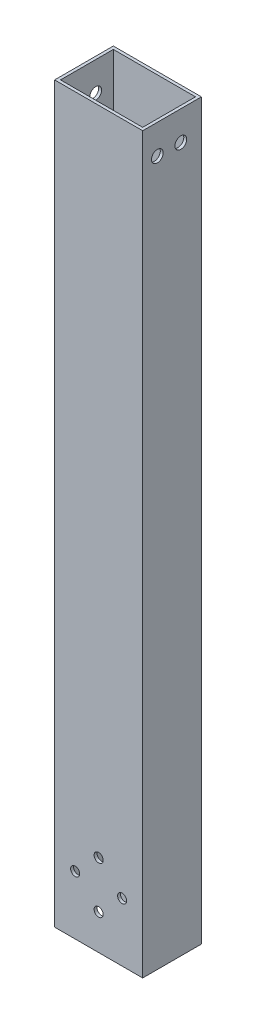
ISO-10303-21;
HEADER;
FILE_DESCRIPTION(('STEP AP214'),'2;1');
FILE_NAME('part.step','',(''),(''),'','','');
FILE_SCHEMA(('AUTOMOTIVE_DESIGN { 1 0 10303 214 1 1 1 1 }'));
ENDSEC;
DATA;
#1=APPLICATION_CONTEXT('core data for automotive mechanical design processes');
#2=APPLICATION_PROTOCOL_DEFINITION('international standard','automotive_design',2000,#1);
#3=PRODUCT_CONTEXT('',#1,'mechanical');
#4=PRODUCT('Part','Part','',(#3));
#5=PRODUCT_RELATED_PRODUCT_CATEGORY('part','',(#4));
#6=PRODUCT_DEFINITION_FORMATION('','',#4);
#7=PRODUCT_DEFINITION_CONTEXT('part definition',#1,'design');
#8=PRODUCT_DEFINITION('design','',#6,#7);
#9=PRODUCT_DEFINITION_SHAPE('','',#8);
#10=(LENGTH_UNIT() NAMED_UNIT(*) SI_UNIT(.MILLI.,.METRE.));
#11=(NAMED_UNIT(*) PLANE_ANGLE_UNIT() SI_UNIT($,.RADIAN.));
#12=(NAMED_UNIT(*) SI_UNIT($,.STERADIAN.) SOLID_ANGLE_UNIT());
#13=UNCERTAINTY_MEASURE_WITH_UNIT(LENGTH_MEASURE(1.E-05),#10,'distance_accuracy_value','');
#14=(GEOMETRIC_REPRESENTATION_CONTEXT(3) GLOBAL_UNCERTAINTY_ASSIGNED_CONTEXT((#13)) GLOBAL_UNIT_ASSIGNED_CONTEXT((#10,
#11,#12)) REPRESENTATION_CONTEXT('',''));
#15=CARTESIAN_POINT('',(0.,0.,0.));
#16=DIRECTION('',(0.,0.,1.));
#17=DIRECTION('',(1.,0.,0.));
#18=AXIS2_PLACEMENT_3D('',#15,#16,#17);
#19=CARTESIAN_POINT('',(0.,250.,0.));
#20=DIRECTION('',(0.,-1.,0.));
#21=DIRECTION('',(0.,0.,-1.));
#22=AXIS2_PLACEMENT_3D('',#19,#20,#21);
#23=PLANE('',#22);
#24=DIRECTION('',(0.,0.,-1.));
#25=VECTOR('',#24,1.);
#26=CARTESIAN_POINT('',(15.,250.,10.));
#27=LINE('',#26,#25);
#28=CARTESIAN_POINT('',(15.,250.,10.));
#29=VERTEX_POINT('',#28);
#30=CARTESIAN_POINT('',(15.,250.,-10.));
#31=VERTEX_POINT('',#30);
#32=EDGE_CURVE('E140',#29,#31,#27,.T.);
#33=ORIENTED_EDGE('',*,*,#32,.T.);
#34=DIRECTION('',(-1.,0.,0.));
#35=VECTOR('',#34,1.);
#36=CARTESIAN_POINT('',(-15.,250.,-10.));
#37=LINE('',#36,#35);
#38=CARTESIAN_POINT('',(-15.,250.,-10.));
#39=VERTEX_POINT('',#38);
#40=EDGE_CURVE('E143',#31,#39,#37,.T.);
#41=ORIENTED_EDGE('',*,*,#40,.T.);
#42=DIRECTION('',(0.,0.,1.));
#43=VECTOR('',#42,1.);
#44=CARTESIAN_POINT('',(-15.,250.,10.));
#45=LINE('',#44,#43);
#46=CARTESIAN_POINT('',(-15.,250.,10.));
#47=VERTEX_POINT('',#46);
#48=EDGE_CURVE('E146',#39,#47,#45,.T.);
#49=ORIENTED_EDGE('',*,*,#48,.T.);
#50=DIRECTION('',(1.,0.,0.));
#51=VECTOR('',#50,1.);
#52=CARTESIAN_POINT('',(-15.,250.,10.));
#53=LINE('',#52,#51);
#54=EDGE_CURVE('E148',#47,#29,#53,.T.);
#55=ORIENTED_EDGE('',*,*,#54,.T.);
#56=EDGE_LOOP('',(#33,#41,#49,#55));
#57=FACE_BOUND('',#56,.T.);
#58=DIRECTION('',(0.,0.,-1.));
#59=VECTOR('',#58,1.);
#60=CARTESIAN_POINT('',(14.,250.,9.00000000000001));
#61=LINE('',#60,#59);
#62=CARTESIAN_POINT('',(14.,250.,9.00000000000001));
#63=VERTEX_POINT('',#62);
#64=CARTESIAN_POINT('',(14.,250.,-9.00000000000001));
#65=VERTEX_POINT('',#64);
#66=EDGE_CURVE('E102',#63,#65,#61,.T.);
#67=ORIENTED_EDGE('',*,*,#66,.F.);
#68=DIRECTION('',(1.,0.,0.));
#69=VECTOR('',#68,1.);
#70=CARTESIAN_POINT('',(-14.,250.,9.00000000000001));
#71=LINE('',#70,#69);
#72=CARTESIAN_POINT('',(-14.,250.,9.00000000000001));
#73=VERTEX_POINT('',#72);
#74=EDGE_CURVE('E124',#73,#63,#71,.T.);
#75=ORIENTED_EDGE('',*,*,#74,.F.);
#76=DIRECTION('',(0.,0.,1.));
#77=VECTOR('',#76,1.);
#78=CARTESIAN_POINT('',(-14.,250.,9.00000000000001));
#79=LINE('',#78,#77);
#80=CARTESIAN_POINT('',(-14.,250.,-9.));
#81=VERTEX_POINT('',#80);
#82=EDGE_CURVE('E122',#81,#73,#79,.T.);
#83=ORIENTED_EDGE('',*,*,#82,.F.);
#84=DIRECTION('',(-1.,0.,0.));
#85=VECTOR('',#84,1.);
#86=CARTESIAN_POINT('',(-14.,250.,-9.));
#87=LINE('',#86,#85);
#88=EDGE_CURVE('E110',#65,#81,#87,.T.);
#89=ORIENTED_EDGE('',*,*,#88,.F.);
#90=EDGE_LOOP('',(#67,#75,#83,#89));
#91=FACE_BOUND('',#90,.T.);
#92=ADVANCED_FACE('F35',(#57,#91),#23,.F.);
#93=CARTESIAN_POINT('',(0.,0.,0.));
#94=DIRECTION('',(0.,-1.,0.));
#95=DIRECTION('',(0.,0.,-1.));
#96=AXIS2_PLACEMENT_3D('',#93,#94,#95);
#97=PLANE('',#96);
#98=DIRECTION('',(0.,0.,-1.));
#99=VECTOR('',#98,1.);
#100=CARTESIAN_POINT('',(15.,0.,10.));
#101=LINE('',#100,#99);
#102=CARTESIAN_POINT('',(15.,0.,10.));
#103=VERTEX_POINT('',#102);
#104=CARTESIAN_POINT('',(15.,0.,-10.));
#105=VERTEX_POINT('',#104);
#106=EDGE_CURVE('E118',#103,#105,#101,.T.);
#107=ORIENTED_EDGE('',*,*,#106,.F.);
#108=DIRECTION('',(1.,0.,0.));
#109=VECTOR('',#108,1.);
#110=CARTESIAN_POINT('',(-15.,0.,10.));
#111=LINE('',#110,#109);
#112=CARTESIAN_POINT('',(-15.,0.,10.));
#113=VERTEX_POINT('',#112);
#114=EDGE_CURVE('E144',#113,#103,#111,.T.);
#115=ORIENTED_EDGE('',*,*,#114,.F.);
#116=DIRECTION('',(0.,0.,1.));
#117=VECTOR('',#116,1.);
#118=CARTESIAN_POINT('',(-15.,0.,10.));
#119=LINE('',#118,#117);
#120=CARTESIAN_POINT('',(-15.,0.,-10.));
#121=VERTEX_POINT('',#120);
#122=EDGE_CURVE('E155',#121,#113,#119,.T.);
#123=ORIENTED_EDGE('',*,*,#122,.F.);
#124=DIRECTION('',(-1.,0.,0.));
#125=VECTOR('',#124,1.);
#126=CARTESIAN_POINT('',(-15.,0.,-10.));
#127=LINE('',#126,#125);
#128=EDGE_CURVE('E153',#105,#121,#127,.T.);
#129=ORIENTED_EDGE('',*,*,#128,.F.);
#130=EDGE_LOOP('',(#107,#115,#123,#129));
#131=FACE_BOUND('',#130,.T.);
#132=DIRECTION('',(1.,0.,0.));
#133=VECTOR('',#132,1.);
#134=CARTESIAN_POINT('',(-14.,0.,9.00000000000001));
#135=LINE('',#134,#133);
#136=CARTESIAN_POINT('',(-14.,0.,9.00000000000001));
#137=VERTEX_POINT('',#136);
#138=CARTESIAN_POINT('',(14.,0.,9.00000000000001));
#139=VERTEX_POINT('',#138);
#140=EDGE_CURVE('E111',#137,#139,#135,.T.);
#141=ORIENTED_EDGE('',*,*,#140,.T.);
#142=DIRECTION('',(0.,0.,-1.));
#143=VECTOR('',#142,1.);
#144=CARTESIAN_POINT('',(14.,0.,9.00000000000001));
#145=LINE('',#144,#143);
#146=CARTESIAN_POINT('',(14.,0.,-9.00000000000001));
#147=VERTEX_POINT('',#146);
#148=EDGE_CURVE('E60',#139,#147,#145,.T.);
#149=ORIENTED_EDGE('',*,*,#148,.T.);
#150=DIRECTION('',(-1.,0.,0.));
#151=VECTOR('',#150,1.);
#152=CARTESIAN_POINT('',(-14.,0.,-9.));
#153=LINE('',#152,#151);
#154=CARTESIAN_POINT('',(-14.,0.,-9.));
#155=VERTEX_POINT('',#154);
#156=EDGE_CURVE('E117',#147,#155,#153,.T.);
#157=ORIENTED_EDGE('',*,*,#156,.T.);
#158=DIRECTION('',(0.,0.,1.));
#159=VECTOR('',#158,1.);
#160=CARTESIAN_POINT('',(-14.,0.,9.00000000000001));
#161=LINE('',#160,#159);
#162=EDGE_CURVE('E132',#155,#137,#161,.T.);
#163=ORIENTED_EDGE('',*,*,#162,.T.);
#164=EDGE_LOOP('',(#141,#149,#157,#163));
#165=FACE_BOUND('',#164,.T.);
#166=ADVANCED_FACE('F272',(#131,#165),#97,.T.);
#167=CARTESIAN_POINT('',(15.,250.,10.));
#168=DIRECTION('',(-1.,0.,0.));
#169=DIRECTION('',(0.,0.,1.));
#170=AXIS2_PLACEMENT_3D('',#167,#168,#169);
#171=PLANE('',#170);
#172=CARTESIAN_POINT('',(15.,240.,5.));
#173=DIRECTION('',(1.,0.,0.));
#174=DIRECTION('',(0.,0.,-1.));
#175=AXIS2_PLACEMENT_3D('',#172,#173,#174);
#176=CIRCLE('',#175,2.);
#177=CARTESIAN_POINT('',(15.,240.,3.));
#178=VERTEX_POINT('',#177);
#179=EDGE_CURVE('E189',#178,#178,#176,.T.);
#180=ORIENTED_EDGE('',*,*,#179,.F.);
#181=EDGE_LOOP('',(#180));
#182=FACE_BOUND('',#181,.T.);
#183=CARTESIAN_POINT('',(15.,240.,-3.));
#184=DIRECTION('',(1.,0.,0.));
#185=DIRECTION('',(0.,0.,-1.));
#186=AXIS2_PLACEMENT_3D('',#183,#184,#185);
#187=CIRCLE('',#186,2.);
#188=CARTESIAN_POINT('',(15.,240.,-5.));
#189=VERTEX_POINT('',#188);
#190=EDGE_CURVE('E197',#189,#189,#187,.T.);
#191=ORIENTED_EDGE('',*,*,#190,.F.);
#192=EDGE_LOOP('',(#191));
#193=FACE_BOUND('',#192,.T.);
#194=ORIENTED_EDGE('',*,*,#106,.T.);
#195=DIRECTION('',(0.,-1.,0.));
#196=VECTOR('',#195,1.);
#197=CARTESIAN_POINT('',(15.,250.,-10.));
#198=LINE('',#197,#196);
#199=EDGE_CURVE('E11',#31,#105,#198,.T.);
#200=ORIENTED_EDGE('',*,*,#199,.F.);
#201=ORIENTED_EDGE('',*,*,#32,.F.);
#202=DIRECTION('',(0.,-1.,0.));
#203=VECTOR('',#202,1.);
#204=CARTESIAN_POINT('',(15.,250.,10.));
#205=LINE('',#204,#203);
#206=EDGE_CURVE('E150',#29,#103,#205,.T.);
#207=ORIENTED_EDGE('',*,*,#206,.T.);
#208=EDGE_LOOP('',(#194,#200,#201,#207));
#209=FACE_BOUND('',#208,.T.);
#210=ADVANCED_FACE('F37',(#182,#193,#209),#171,.F.);
#211=CARTESIAN_POINT('',(-15.,250.,-10.));
#212=DIRECTION('',(0.,0.,1.));
#213=DIRECTION('',(1.,0.,0.));
#214=AXIS2_PLACEMENT_3D('',#211,#212,#213);
#215=PLANE('',#214);
#216=CARTESIAN_POINT('',(1.26257310727977E-13,28.,-10.));
#217=DIRECTION('',(0.,0.,1.));
#218=DIRECTION('',(1.,0.,0.));
#219=AXIS2_PLACEMENT_3D('',#216,#217,#218);
#220=CIRCLE('',#219,1.54999999999989);
#221=CARTESIAN_POINT('',(1.55000000000002,28.,-10.));
#222=VERTEX_POINT('',#221);
#223=EDGE_CURVE('E169',#222,#222,#220,.T.);
#224=ORIENTED_EDGE('',*,*,#223,.T.);
#225=EDGE_LOOP('',(#224));
#226=FACE_BOUND('',#225,.T.);
#227=CARTESIAN_POINT('',(8.00000000000013,20.,-10.));
#228=DIRECTION('',(0.,0.,1.));
#229=DIRECTION('',(1.,0.,0.));
#230=AXIS2_PLACEMENT_3D('',#227,#228,#229);
#231=CIRCLE('',#230,1.55);
#232=CARTESIAN_POINT('',(9.55000000000013,20.,-10.));
#233=VERTEX_POINT('',#232);
#234=EDGE_CURVE('E209',#233,#233,#231,.T.);
#235=ORIENTED_EDGE('',*,*,#234,.T.);
#236=EDGE_LOOP('',(#235));
#237=FACE_BOUND('',#236,.T.);
#238=CARTESIAN_POINT('',(1.26257310727977E-13,12.,-10.));
#239=DIRECTION('',(0.,0.,1.));
#240=DIRECTION('',(1.,0.,0.));
#241=AXIS2_PLACEMENT_3D('',#238,#239,#240);
#242=CIRCLE('',#241,1.55000000000011);
#243=CARTESIAN_POINT('',(1.55000000000023,12.,-10.));
#244=VERTEX_POINT('',#243);
#245=EDGE_CURVE('E215',#244,#244,#242,.T.);
#246=ORIENTED_EDGE('',*,*,#245,.T.);
#247=EDGE_LOOP('',(#246));
#248=FACE_BOUND('',#247,.T.);
#249=CARTESIAN_POINT('',(-7.99999999999988,20.,-10.));
#250=DIRECTION('',(0.,0.,1.));
#251=DIRECTION('',(1.,0.,0.));
#252=AXIS2_PLACEMENT_3D('',#249,#250,#251);
#253=CIRCLE('',#252,1.55000000000001);
#254=CARTESIAN_POINT('',(-6.44999999999987,20.,-10.));
#255=VERTEX_POINT('',#254);
#256=EDGE_CURVE('E221',#255,#255,#253,.T.);
#257=ORIENTED_EDGE('',*,*,#256,.T.);
#258=EDGE_LOOP('',(#257));
#259=FACE_BOUND('',#258,.T.);
#260=ORIENTED_EDGE('',*,*,#128,.T.);
#261=DIRECTION('',(0.,-1.,0.));
#262=VECTOR('',#261,1.);
#263=CARTESIAN_POINT('',(-15.,250.,-10.));
#264=LINE('',#263,#262);
#265=EDGE_CURVE('E44',#39,#121,#264,.T.);
#266=ORIENTED_EDGE('',*,*,#265,.F.);
#267=ORIENTED_EDGE('',*,*,#40,.F.);
#268=ORIENTED_EDGE('',*,*,#199,.T.);
#269=EDGE_LOOP('',(#260,#266,#267,#268));
#270=FACE_BOUND('',#269,.T.);
#271=ADVANCED_FACE('F258',(#226,#237,#248,#259,#270),#215,.F.);
#272=CARTESIAN_POINT('',(-15.,250.,10.));
#273=DIRECTION('',(1.,0.,0.));
#274=DIRECTION('',(0.,0.,-1.));
#275=AXIS2_PLACEMENT_3D('',#272,#273,#274);
#276=PLANE('',#275);
#277=CARTESIAN_POINT('',(-15.,240.,5.));
#278=DIRECTION('',(1.,0.,0.));
#279=DIRECTION('',(0.,0.,-1.));
#280=AXIS2_PLACEMENT_3D('',#277,#278,#279);
#281=CIRCLE('',#280,2.);
#282=CARTESIAN_POINT('',(-15.,240.,3.));
#283=VERTEX_POINT('',#282);
#284=EDGE_CURVE('E183',#283,#283,#281,.T.);
#285=ORIENTED_EDGE('',*,*,#284,.T.);
#286=EDGE_LOOP('',(#285));
#287=FACE_BOUND('',#286,.T.);
#288=CARTESIAN_POINT('',(-15.,240.,-3.));
#289=DIRECTION('',(1.,0.,0.));
#290=DIRECTION('',(0.,0.,-1.));
#291=AXIS2_PLACEMENT_3D('',#288,#289,#290);
#292=CIRCLE('',#291,2.);
#293=CARTESIAN_POINT('',(-15.,240.,-5.));
#294=VERTEX_POINT('',#293);
#295=EDGE_CURVE('E194',#294,#294,#292,.T.);
#296=ORIENTED_EDGE('',*,*,#295,.T.);
#297=EDGE_LOOP('',(#296));
#298=FACE_BOUND('',#297,.T.);
#299=ORIENTED_EDGE('',*,*,#122,.T.);
#300=DIRECTION('',(0.,-1.,0.));
#301=VECTOR('',#300,1.);
#302=CARTESIAN_POINT('',(-15.,250.,10.));
#303=LINE('',#302,#301);
#304=EDGE_CURVE('E160',#47,#113,#303,.T.);
#305=ORIENTED_EDGE('',*,*,#304,.F.);
#306=ORIENTED_EDGE('',*,*,#48,.F.);
#307=ORIENTED_EDGE('',*,*,#265,.T.);
#308=EDGE_LOOP('',(#299,#305,#306,#307));
#309=FACE_BOUND('',#308,.T.);
#310=ADVANCED_FACE('F261',(#287,#298,#309),#276,.F.);
#311=CARTESIAN_POINT('',(-15.,250.,10.));
#312=DIRECTION('',(0.,0.,-1.));
#313=DIRECTION('',(-1.,0.,0.));
#314=AXIS2_PLACEMENT_3D('',#311,#312,#313);
#315=PLANE('',#314);
#316=CARTESIAN_POINT('',(1.26257310727977E-13,28.,10.));
#317=DIRECTION('',(0.,0.,1.));
#318=DIRECTION('',(1.,0.,0.));
#319=AXIS2_PLACEMENT_3D('',#316,#317,#318);
#320=CIRCLE('',#319,1.54999999999989);
#321=CARTESIAN_POINT('',(1.55000000000002,28.,10.));
#322=VERTEX_POINT('',#321);
#323=EDGE_CURVE('E206',#322,#322,#320,.T.);
#324=ORIENTED_EDGE('',*,*,#323,.F.);
#325=EDGE_LOOP('',(#324));
#326=FACE_BOUND('',#325,.T.);
#327=CARTESIAN_POINT('',(8.00000000000013,20.,10.));
#328=DIRECTION('',(0.,0.,1.));
#329=DIRECTION('',(1.,0.,0.));
#330=AXIS2_PLACEMENT_3D('',#327,#328,#329);
#331=CIRCLE('',#330,1.55);
#332=CARTESIAN_POINT('',(9.55000000000013,20.,10.));
#333=VERTEX_POINT('',#332);
#334=EDGE_CURVE('E212',#333,#333,#331,.T.);
#335=ORIENTED_EDGE('',*,*,#334,.F.);
#336=EDGE_LOOP('',(#335));
#337=FACE_BOUND('',#336,.T.);
#338=CARTESIAN_POINT('',(1.26257310727977E-13,12.,10.));
#339=DIRECTION('',(0.,0.,1.));
#340=DIRECTION('',(1.,0.,0.));
#341=AXIS2_PLACEMENT_3D('',#338,#339,#340);
#342=CIRCLE('',#341,1.55000000000011);
#343=CARTESIAN_POINT('',(1.55000000000023,12.,10.));
#344=VERTEX_POINT('',#343);
#345=EDGE_CURVE('E218',#344,#344,#342,.T.);
#346=ORIENTED_EDGE('',*,*,#345,.F.);
#347=EDGE_LOOP('',(#346));
#348=FACE_BOUND('',#347,.T.);
#349=CARTESIAN_POINT('',(-7.99999999999988,20.,10.));
#350=DIRECTION('',(0.,0.,1.));
#351=DIRECTION('',(1.,0.,0.));
#352=AXIS2_PLACEMENT_3D('',#349,#350,#351);
#353=CIRCLE('',#352,1.55000000000001);
#354=CARTESIAN_POINT('',(-6.44999999999987,20.,10.));
#355=VERTEX_POINT('',#354);
#356=EDGE_CURVE('E205',#355,#355,#353,.T.);
#357=ORIENTED_EDGE('',*,*,#356,.F.);
#358=EDGE_LOOP('',(#357));
#359=FACE_BOUND('',#358,.T.);
#360=ORIENTED_EDGE('',*,*,#114,.T.);
#361=ORIENTED_EDGE('',*,*,#206,.F.);
#362=ORIENTED_EDGE('',*,*,#54,.F.);
#363=ORIENTED_EDGE('',*,*,#304,.T.);
#364=EDGE_LOOP('',(#360,#361,#362,#363));
#365=FACE_BOUND('',#364,.T.);
#366=ADVANCED_FACE('F276',(#326,#337,#348,#359,#365),#315,.F.);
#367=CARTESIAN_POINT('',(14.,250.,9.00000000000001));
#368=DIRECTION('',(-1.,0.,0.));
#369=DIRECTION('',(0.,0.,1.));
#370=AXIS2_PLACEMENT_3D('',#367,#368,#369);
#371=PLANE('',#370);
#372=CARTESIAN_POINT('',(14.,240.,5.));
#373=DIRECTION('',(-1.,0.,0.));
#374=DIRECTION('',(0.,0.,1.));
#375=AXIS2_PLACEMENT_3D('',#372,#373,#374);
#376=CIRCLE('',#375,2.);
#377=CARTESIAN_POINT('',(14.,240.,7.00000000000001));
#378=VERTEX_POINT('',#377);
#379=EDGE_CURVE('E202',#378,#378,#376,.T.);
#380=ORIENTED_EDGE('',*,*,#379,.F.);
#381=EDGE_LOOP('',(#380));
#382=FACE_BOUND('',#381,.T.);
#383=CARTESIAN_POINT('',(14.,240.,-3.));
#384=DIRECTION('',(-1.,0.,0.));
#385=DIRECTION('',(0.,0.,1.));
#386=AXIS2_PLACEMENT_3D('',#383,#384,#385);
#387=CIRCLE('',#386,2.);
#388=CARTESIAN_POINT('',(14.,240.,-0.999999999999999));
#389=VERTEX_POINT('',#388);
#390=EDGE_CURVE('E182',#389,#389,#387,.T.);
#391=ORIENTED_EDGE('',*,*,#390,.F.);
#392=EDGE_LOOP('',(#391));
#393=FACE_BOUND('',#392,.T.);
#394=ORIENTED_EDGE('',*,*,#148,.F.);
#395=DIRECTION('',(0.,-1.,0.));
#396=VECTOR('',#395,1.);
#397=CARTESIAN_POINT('',(14.,250.,9.00000000000001));
#398=LINE('',#397,#396);
#399=EDGE_CURVE('E106',#63,#139,#398,.T.);
#400=ORIENTED_EDGE('',*,*,#399,.F.);
#401=ORIENTED_EDGE('',*,*,#66,.T.);
#402=DIRECTION('',(0.,-1.,0.));
#403=VECTOR('',#402,1.);
#404=CARTESIAN_POINT('',(14.,250.,-9.00000000000001));
#405=LINE('',#404,#403);
#406=EDGE_CURVE('E105',#65,#147,#405,.T.);
#407=ORIENTED_EDGE('',*,*,#406,.T.);
#408=EDGE_LOOP('',(#394,#400,#401,#407));
#409=FACE_BOUND('',#408,.T.);
#410=ADVANCED_FACE('F104',(#382,#393,#409),#371,.T.);
#411=CARTESIAN_POINT('',(-14.,250.,-9.));
#412=DIRECTION('',(0.,0.,1.));
#413=DIRECTION('',(1.,0.,0.));
#414=AXIS2_PLACEMENT_3D('',#411,#412,#413);
#415=PLANE('',#414);
#416=CARTESIAN_POINT('',(1.26257310727977E-13,28.,-9.00000000000001));
#417=DIRECTION('',(0.,0.,1.));
#418=DIRECTION('',(1.,0.,0.));
#419=AXIS2_PLACEMENT_3D('',#416,#417,#418);
#420=CIRCLE('',#419,1.54999999999989);
#421=CARTESIAN_POINT('',(1.55000000000002,28.,-9.00000000000001));
#422=VERTEX_POINT('',#421);
#423=EDGE_CURVE('E130',#422,#422,#420,.T.);
#424=ORIENTED_EDGE('',*,*,#423,.F.);
#425=EDGE_LOOP('',(#424));
#426=FACE_BOUND('',#425,.T.);
#427=CARTESIAN_POINT('',(8.00000000000013,20.,-9.00000000000001));
#428=DIRECTION('',(0.,0.,1.));
#429=DIRECTION('',(1.,0.,0.));
#430=AXIS2_PLACEMENT_3D('',#427,#428,#429);
#431=CIRCLE('',#430,1.55);
#432=CARTESIAN_POINT('',(9.55000000000013,20.,-9.00000000000001));
#433=VERTEX_POINT('',#432);
#434=EDGE_CURVE('E177',#433,#433,#431,.T.);
#435=ORIENTED_EDGE('',*,*,#434,.F.);
#436=EDGE_LOOP('',(#435));
#437=FACE_BOUND('',#436,.T.);
#438=CARTESIAN_POINT('',(1.26257310727977E-13,12.,-9.00000000000001));
#439=DIRECTION('',(0.,0.,1.));
#440=DIRECTION('',(1.,0.,0.));
#441=AXIS2_PLACEMENT_3D('',#438,#439,#440);
#442=CIRCLE('',#441,1.55000000000011);
#443=CARTESIAN_POINT('',(1.55000000000023,12.,-9.00000000000001));
#444=VERTEX_POINT('',#443);
#445=EDGE_CURVE('E173',#444,#444,#442,.T.);
#446=ORIENTED_EDGE('',*,*,#445,.F.);
#447=EDGE_LOOP('',(#446));
#448=FACE_BOUND('',#447,.T.);
#449=CARTESIAN_POINT('',(-7.99999999999988,20.,-9.));
#450=DIRECTION('',(0.,0.,1.));
#451=DIRECTION('',(1.,0.,0.));
#452=AXIS2_PLACEMENT_3D('',#449,#450,#451);
#453=CIRCLE('',#452,1.55000000000001);
#454=CARTESIAN_POINT('',(-6.44999999999987,20.,-9.));
#455=VERTEX_POINT('',#454);
#456=EDGE_CURVE('E168',#455,#455,#453,.T.);
#457=ORIENTED_EDGE('',*,*,#456,.F.);
#458=EDGE_LOOP('',(#457));
#459=FACE_BOUND('',#458,.T.);
#460=ORIENTED_EDGE('',*,*,#156,.F.);
#461=ORIENTED_EDGE('',*,*,#406,.F.);
#462=ORIENTED_EDGE('',*,*,#88,.T.);
#463=DIRECTION('',(0.,-1.,0.));
#464=VECTOR('',#463,1.);
#465=CARTESIAN_POINT('',(-14.,250.,-9.));
#466=LINE('',#465,#464);
#467=EDGE_CURVE('E119',#81,#155,#466,.T.);
#468=ORIENTED_EDGE('',*,*,#467,.T.);
#469=EDGE_LOOP('',(#460,#461,#462,#468));
#470=FACE_BOUND('',#469,.T.);
#471=ADVANCED_FACE('F114',(#426,#437,#448,#459,#470),#415,.T.);
#472=CARTESIAN_POINT('',(-14.,250.,9.00000000000001));
#473=DIRECTION('',(1.,0.,0.));
#474=DIRECTION('',(0.,0.,-1.));
#475=AXIS2_PLACEMENT_3D('',#472,#473,#474);
#476=PLANE('',#475);
#477=CARTESIAN_POINT('',(-14.,240.,5.));
#478=DIRECTION('',(1.,0.,0.));
#479=DIRECTION('',(0.,0.,-1.));
#480=AXIS2_PLACEMENT_3D('',#477,#478,#479);
#481=CIRCLE('',#480,2.);
#482=CARTESIAN_POINT('',(-14.,240.,3.));
#483=VERTEX_POINT('',#482);
#484=EDGE_CURVE('E39',#483,#483,#481,.T.);
#485=ORIENTED_EDGE('',*,*,#484,.F.);
#486=EDGE_LOOP('',(#485));
#487=FACE_BOUND('',#486,.T.);
#488=CARTESIAN_POINT('',(-14.,240.,-3.));
#489=DIRECTION('',(1.,0.,0.));
#490=DIRECTION('',(0.,0.,-1.));
#491=AXIS2_PLACEMENT_3D('',#488,#489,#490);
#492=CIRCLE('',#491,2.);
#493=CARTESIAN_POINT('',(-14.,240.,-5.));
#494=VERTEX_POINT('',#493);
#495=EDGE_CURVE('E180',#494,#494,#492,.T.);
#496=ORIENTED_EDGE('',*,*,#495,.F.);
#497=EDGE_LOOP('',(#496));
#498=FACE_BOUND('',#497,.T.);
#499=ORIENTED_EDGE('',*,*,#162,.F.);
#500=ORIENTED_EDGE('',*,*,#467,.F.);
#501=ORIENTED_EDGE('',*,*,#82,.T.);
#502=DIRECTION('',(0.,-1.,0.));
#503=VECTOR('',#502,1.);
#504=CARTESIAN_POINT('',(-14.,250.,9.00000000000001));
#505=LINE('',#504,#503);
#506=EDGE_CURVE('E52',#73,#137,#505,.T.);
#507=ORIENTED_EDGE('',*,*,#506,.T.);
#508=EDGE_LOOP('',(#499,#500,#501,#507));
#509=FACE_BOUND('',#508,.T.);
#510=ADVANCED_FACE('F241',(#487,#498,#509),#476,.T.);
#511=CARTESIAN_POINT('',(-14.,250.,9.00000000000001));
#512=DIRECTION('',(0.,0.,-1.));
#513=DIRECTION('',(-1.,0.,0.));
#514=AXIS2_PLACEMENT_3D('',#511,#512,#513);
#515=PLANE('',#514);
#516=CARTESIAN_POINT('',(1.26257310727977E-13,28.,9.00000000000001));
#517=DIRECTION('',(0.,0.,-1.));
#518=DIRECTION('',(-1.,0.,0.));
#519=AXIS2_PLACEMENT_3D('',#516,#517,#518);
#520=CIRCLE('',#519,1.54999999999989);
#521=CARTESIAN_POINT('',(-1.54999999999977,28.,9.00000000000001));
#522=VERTEX_POINT('',#521);
#523=EDGE_CURVE('E178',#522,#522,#520,.T.);
#524=ORIENTED_EDGE('',*,*,#523,.F.);
#525=EDGE_LOOP('',(#524));
#526=FACE_BOUND('',#525,.T.);
#527=CARTESIAN_POINT('',(8.00000000000013,20.,9.00000000000001));
#528=DIRECTION('',(0.,0.,-1.));
#529=DIRECTION('',(-1.,0.,0.));
#530=AXIS2_PLACEMENT_3D('',#527,#528,#529);
#531=CIRCLE('',#530,1.55);
#532=CARTESIAN_POINT('',(6.45000000000013,20.,9.00000000000001));
#533=VERTEX_POINT('',#532);
#534=EDGE_CURVE('E174',#533,#533,#531,.T.);
#535=ORIENTED_EDGE('',*,*,#534,.F.);
#536=EDGE_LOOP('',(#535));
#537=FACE_BOUND('',#536,.T.);
#538=CARTESIAN_POINT('',(1.26257310727977E-13,12.,9.00000000000001));
#539=DIRECTION('',(0.,0.,-1.));
#540=DIRECTION('',(-1.,0.,0.));
#541=AXIS2_PLACEMENT_3D('',#538,#539,#540);
#542=CIRCLE('',#541,1.55000000000011);
#543=CARTESIAN_POINT('',(-1.54999999999998,12.,9.00000000000001));
#544=VERTEX_POINT('',#543);
#545=EDGE_CURVE('E170',#544,#544,#542,.T.);
#546=ORIENTED_EDGE('',*,*,#545,.F.);
#547=EDGE_LOOP('',(#546));
#548=FACE_BOUND('',#547,.T.);
#549=CARTESIAN_POINT('',(-7.99999999999988,20.,9.00000000000001));
#550=DIRECTION('',(0.,0.,-1.));
#551=DIRECTION('',(-1.,0.,0.));
#552=AXIS2_PLACEMENT_3D('',#549,#550,#551);
#553=CIRCLE('',#552,1.55000000000001);
#554=CARTESIAN_POINT('',(-9.54999999999988,20.,9.00000000000001));
#555=VERTEX_POINT('',#554);
#556=EDGE_CURVE('E165',#555,#555,#553,.T.);
#557=ORIENTED_EDGE('',*,*,#556,.F.);
#558=EDGE_LOOP('',(#557));
#559=FACE_BOUND('',#558,.T.);
#560=ORIENTED_EDGE('',*,*,#140,.F.);
#561=ORIENTED_EDGE('',*,*,#506,.F.);
#562=ORIENTED_EDGE('',*,*,#74,.T.);
#563=ORIENTED_EDGE('',*,*,#399,.T.);
#564=EDGE_LOOP('',(#560,#561,#562,#563));
#565=FACE_BOUND('',#564,.T.);
#566=ADVANCED_FACE('F394',(#526,#537,#548,#559,#565),#515,.T.);
#567=CARTESIAN_POINT('',(-7.99999999999988,20.,-10.));
#568=DIRECTION('',(0.,0.,1.));
#569=DIRECTION('',(1.,0.,0.));
#570=AXIS2_PLACEMENT_3D('',#567,#568,#569);
#571=CYLINDRICAL_SURFACE('',#570,1.55000000000001);
#572=ORIENTED_EDGE('',*,*,#556,.T.);
#573=EDGE_LOOP('',(#572));
#574=FACE_BOUND('',#573,.T.);
#575=ORIENTED_EDGE('',*,*,#356,.T.);
#576=EDGE_LOOP('',(#575));
#577=FACE_BOUND('',#576,.T.);
#578=ADVANCED_FACE('F255',(#574,#577),#571,.F.);
#579=CARTESIAN_POINT('',(1.26257310727977E-13,12.,-10.));
#580=DIRECTION('',(0.,0.,1.));
#581=DIRECTION('',(1.,0.,0.));
#582=AXIS2_PLACEMENT_3D('',#579,#580,#581);
#583=CYLINDRICAL_SURFACE('',#582,1.55000000000011);
#584=ORIENTED_EDGE('',*,*,#545,.T.);
#585=EDGE_LOOP('',(#584));
#586=FACE_BOUND('',#585,.T.);
#587=ORIENTED_EDGE('',*,*,#345,.T.);
#588=EDGE_LOOP('',(#587));
#589=FACE_BOUND('',#588,.T.);
#590=ADVANCED_FACE('F356',(#586,#589),#583,.F.);
#591=CARTESIAN_POINT('',(8.00000000000013,20.,-10.));
#592=DIRECTION('',(0.,0.,1.));
#593=DIRECTION('',(1.,0.,0.));
#594=AXIS2_PLACEMENT_3D('',#591,#592,#593);
#595=CYLINDRICAL_SURFACE('',#594,1.55);
#596=ORIENTED_EDGE('',*,*,#534,.T.);
#597=EDGE_LOOP('',(#596));
#598=FACE_BOUND('',#597,.T.);
#599=ORIENTED_EDGE('',*,*,#334,.T.);
#600=EDGE_LOOP('',(#599));
#601=FACE_BOUND('',#600,.T.);
#602=ADVANCED_FACE('F346',(#598,#601),#595,.F.);
#603=CARTESIAN_POINT('',(1.26257310727977E-13,28.,-10.));
#604=DIRECTION('',(0.,0.,1.));
#605=DIRECTION('',(1.,0.,0.));
#606=AXIS2_PLACEMENT_3D('',#603,#604,#605);
#607=CYLINDRICAL_SURFACE('',#606,1.54999999999989);
#608=ORIENTED_EDGE('',*,*,#523,.T.);
#609=EDGE_LOOP('',(#608));
#610=FACE_BOUND('',#609,.T.);
#611=ORIENTED_EDGE('',*,*,#323,.T.);
#612=EDGE_LOOP('',(#611));
#613=FACE_BOUND('',#612,.T.);
#614=ADVANCED_FACE('F253',(#610,#613),#607,.F.);
#615=ORIENTED_EDGE('',*,*,#456,.T.);
#616=EDGE_LOOP('',(#615));
#617=FACE_BOUND('',#616,.T.);
#618=ORIENTED_EDGE('',*,*,#256,.F.);
#619=EDGE_LOOP('',(#618));
#620=FACE_BOUND('',#619,.T.);
#621=ADVANCED_FACE('F249',(#617,#620),#571,.F.);
#622=ORIENTED_EDGE('',*,*,#445,.T.);
#623=EDGE_LOOP('',(#622));
#624=FACE_BOUND('',#623,.T.);
#625=ORIENTED_EDGE('',*,*,#245,.F.);
#626=EDGE_LOOP('',(#625));
#627=FACE_BOUND('',#626,.T.);
#628=ADVANCED_FACE('F252',(#624,#627),#583,.F.);
#629=ORIENTED_EDGE('',*,*,#434,.T.);
#630=EDGE_LOOP('',(#629));
#631=FACE_BOUND('',#630,.T.);
#632=ORIENTED_EDGE('',*,*,#234,.F.);
#633=EDGE_LOOP('',(#632));
#634=FACE_BOUND('',#633,.T.);
#635=ADVANCED_FACE('F312',(#631,#634),#595,.F.);
#636=ORIENTED_EDGE('',*,*,#423,.T.);
#637=EDGE_LOOP('',(#636));
#638=FACE_BOUND('',#637,.T.);
#639=ORIENTED_EDGE('',*,*,#223,.F.);
#640=EDGE_LOOP('',(#639));
#641=FACE_BOUND('',#640,.T.);
#642=ADVANCED_FACE('F236',(#638,#641),#607,.F.);
#643=CARTESIAN_POINT('',(-15.,240.,-3.));
#644=DIRECTION('',(1.,0.,0.));
#645=DIRECTION('',(0.,0.,-1.));
#646=AXIS2_PLACEMENT_3D('',#643,#644,#645);
#647=CYLINDRICAL_SURFACE('',#646,2.);
#648=ORIENTED_EDGE('',*,*,#495,.T.);
#649=EDGE_LOOP('',(#648));
#650=FACE_BOUND('',#649,.T.);
#651=ORIENTED_EDGE('',*,*,#295,.F.);
#652=EDGE_LOOP('',(#651));
#653=FACE_BOUND('',#652,.T.);
#654=ADVANCED_FACE('F300',(#650,#653),#647,.F.);
#655=CARTESIAN_POINT('',(-15.,240.,5.));
#656=DIRECTION('',(1.,0.,0.));
#657=DIRECTION('',(0.,0.,-1.));
#658=AXIS2_PLACEMENT_3D('',#655,#656,#657);
#659=CYLINDRICAL_SURFACE('',#658,2.);
#660=ORIENTED_EDGE('',*,*,#484,.T.);
#661=EDGE_LOOP('',(#660));
#662=FACE_BOUND('',#661,.T.);
#663=ORIENTED_EDGE('',*,*,#284,.F.);
#664=EDGE_LOOP('',(#663));
#665=FACE_BOUND('',#664,.T.);
#666=ADVANCED_FACE('F302',(#662,#665),#659,.F.);
#667=ORIENTED_EDGE('',*,*,#390,.T.);
#668=EDGE_LOOP('',(#667));
#669=FACE_BOUND('',#668,.T.);
#670=ORIENTED_EDGE('',*,*,#190,.T.);
#671=EDGE_LOOP('',(#670));
#672=FACE_BOUND('',#671,.T.);
#673=ADVANCED_FACE('F304',(#669,#672),#647,.F.);
#674=ORIENTED_EDGE('',*,*,#379,.T.);
#675=EDGE_LOOP('',(#674));
#676=FACE_BOUND('',#675,.T.);
#677=ORIENTED_EDGE('',*,*,#179,.T.);
#678=EDGE_LOOP('',(#677));
#679=FACE_BOUND('',#678,.T.);
#680=ADVANCED_FACE('F311',(#676,#679),#659,.F.);
#681=CLOSED_SHELL('',(#92,#166,#210,#271,#310,#366,#410,#471,#510,#566,#578,#590,#602,#614,#621,
#628,#635,#642,#654,#666,#673,#680));
#682=MANIFOLD_SOLID_BREP('B2',#681);
#683=ADVANCED_BREP_SHAPE_REPRESENTATION('',(#18,#682),#14);
#684=SHAPE_DEFINITION_REPRESENTATION(#9,#683);
ENDSEC;
END-ISO-10303-21;
